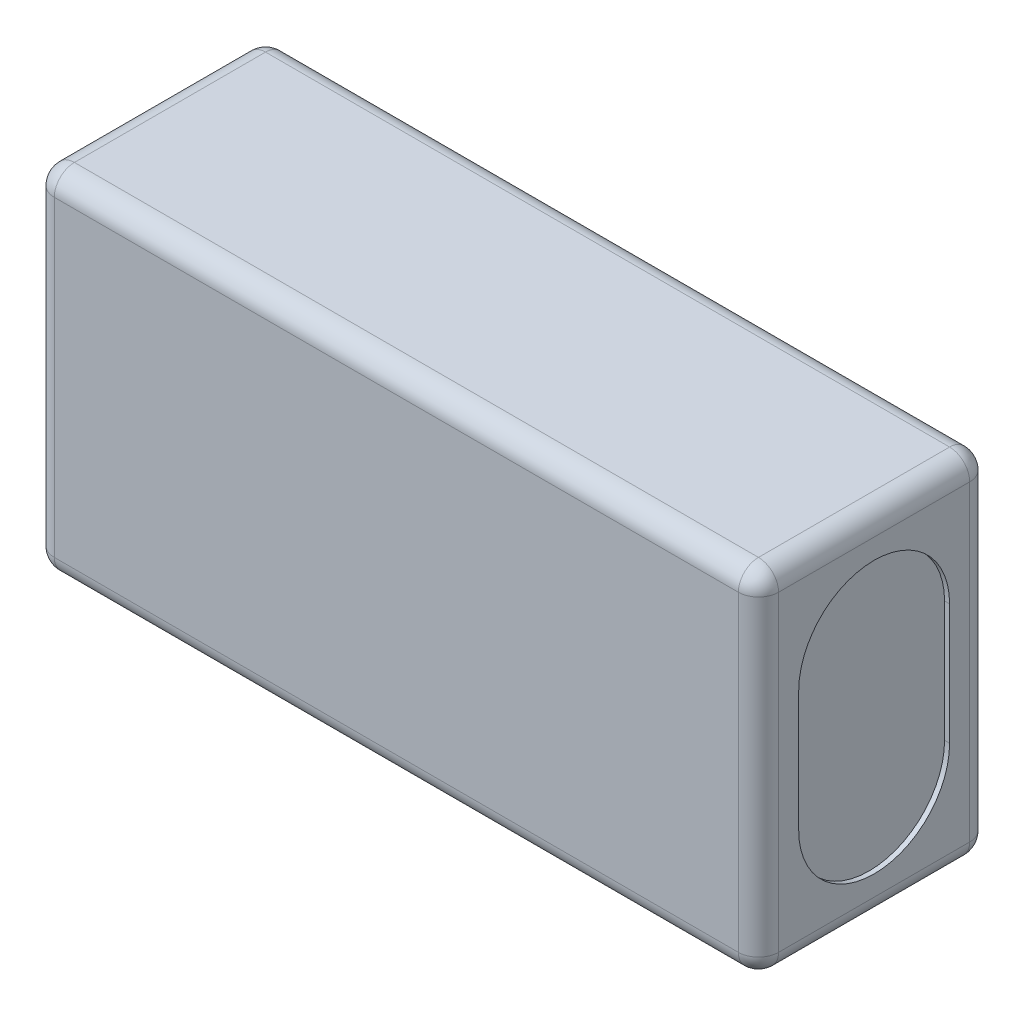
ISO-10303-21;
HEADER;
FILE_DESCRIPTION(('STEP AP214'),'2;1');
FILE_NAME('part.step','',(''),(''),'','','');
FILE_SCHEMA(('AUTOMOTIVE_DESIGN { 1 0 10303 214 1 1 1 1 }'));
ENDSEC;
DATA;
#1=APPLICATION_CONTEXT('core data for automotive mechanical design processes');
#2=APPLICATION_PROTOCOL_DEFINITION('international standard','automotive_design',2000,#1);
#3=PRODUCT_CONTEXT('',#1,'mechanical');
#4=PRODUCT('Part','Part','',(#3));
#5=PRODUCT_RELATED_PRODUCT_CATEGORY('part','',(#4));
#6=PRODUCT_DEFINITION_FORMATION('','',#4);
#7=PRODUCT_DEFINITION_CONTEXT('part definition',#1,'design');
#8=PRODUCT_DEFINITION('design','',#6,#7);
#9=PRODUCT_DEFINITION_SHAPE('','',#8);
#10=(LENGTH_UNIT() NAMED_UNIT(*) SI_UNIT(.MILLI.,.METRE.));
#11=(NAMED_UNIT(*) PLANE_ANGLE_UNIT() SI_UNIT($,.RADIAN.));
#12=(NAMED_UNIT(*) SI_UNIT($,.STERADIAN.) SOLID_ANGLE_UNIT());
#13=UNCERTAINTY_MEASURE_WITH_UNIT(LENGTH_MEASURE(1.E-05),#10,'distance_accuracy_value','');
#14=(GEOMETRIC_REPRESENTATION_CONTEXT(3) GLOBAL_UNCERTAINTY_ASSIGNED_CONTEXT((#13)) GLOBAL_UNIT_ASSIGNED_CONTEXT((#10,
#11,#12)) REPRESENTATION_CONTEXT('',''));
#15=CARTESIAN_POINT('',(0.,0.,0.));
#16=DIRECTION('',(0.,0.,1.));
#17=DIRECTION('',(1.,0.,0.));
#18=AXIS2_PLACEMENT_3D('',#15,#16,#17);
#19=CARTESIAN_POINT('',(-36.,17.5,23.));
#20=DIRECTION('',(1.,0.,0.));
#21=DIRECTION('',(0.,0.,-1.));
#22=AXIS2_PLACEMENT_3D('',#19,#20,#21);
#23=PLANE('',#22);
#24=DIRECTION('',(0.,-1.,0.));
#25=VECTOR('',#24,1.);
#26=CARTESIAN_POINT('',(-36.,17.5,2.));
#27=LINE('',#26,#25);
#28=CARTESIAN_POINT('',(-36.,15.5,2.));
#29=VERTEX_POINT('',#28);
#30=CARTESIAN_POINT('',(-36.,-15.5,2.));
#31=VERTEX_POINT('',#30);
#32=EDGE_CURVE('E259',#29,#31,#27,.T.);
#33=ORIENTED_EDGE('',*,*,#32,.T.);
#34=DIRECTION('',(0.,0.,-1.));
#35=VECTOR('',#34,1.);
#36=CARTESIAN_POINT('',(-36.,-15.5,23.));
#37=LINE('',#36,#35);
#38=CARTESIAN_POINT('',(-36.,-15.5,21.));
#39=VERTEX_POINT('',#38);
#40=EDGE_CURVE('E261',#31,#39,#37,.F.);
#41=ORIENTED_EDGE('',*,*,#40,.T.);
#42=DIRECTION('',(0.,-1.,0.));
#43=VECTOR('',#42,1.);
#44=CARTESIAN_POINT('',(-36.,17.5,21.));
#45=LINE('',#44,#43);
#46=CARTESIAN_POINT('',(-36.,15.5,21.));
#47=VERTEX_POINT('',#46);
#48=EDGE_CURVE('E255',#39,#47,#45,.F.);
#49=ORIENTED_EDGE('',*,*,#48,.T.);
#50=DIRECTION('',(0.,0.,-1.));
#51=VECTOR('',#50,1.);
#52=CARTESIAN_POINT('',(-36.,15.5,23.));
#53=LINE('',#52,#51);
#54=EDGE_CURVE('E257',#47,#29,#53,.T.);
#55=ORIENTED_EDGE('',*,*,#54,.T.);
#56=EDGE_LOOP('',(#33,#41,#49,#55));
#57=FACE_BOUND('',#56,.T.);
#58=CARTESIAN_POINT('',(-36.,6.,11.5));
#59=DIRECTION('',(1.,0.,0.));
#60=DIRECTION('',(0.,1.,0.));
#61=AXIS2_PLACEMENT_3D('',#58,#59,#60);
#62=CIRCLE('',#61,7.50000000000001);
#63=CARTESIAN_POINT('',(-36.,6.,4.));
#64=VERTEX_POINT('',#63);
#65=CARTESIAN_POINT('',(-36.,6.,19.));
#66=VERTEX_POINT('',#65);
#67=EDGE_CURVE('E192',#64,#66,#62,.T.);
#68=ORIENTED_EDGE('',*,*,#67,.T.);
#69=DIRECTION('',(0.,-1.,0.));
#70=VECTOR('',#69,1.);
#71=CARTESIAN_POINT('',(-36.,6.,19.));
#72=LINE('',#71,#70);
#73=CARTESIAN_POINT('',(-36.,-6.,19.));
#74=VERTEX_POINT('',#73);
#75=EDGE_CURVE('E196',#66,#74,#72,.T.);
#76=ORIENTED_EDGE('',*,*,#75,.T.);
#77=CARTESIAN_POINT('',(-36.,-6.,11.5));
#78=DIRECTION('',(1.,0.,0.));
#79=DIRECTION('',(0.,1.,0.));
#80=AXIS2_PLACEMENT_3D('',#77,#78,#79);
#81=CIRCLE('',#80,7.50000000000001);
#82=CARTESIAN_POINT('',(-36.,-5.99999999999999,3.99999999999999));
#83=VERTEX_POINT('',#82);
#84=EDGE_CURVE('E199',#74,#83,#81,.T.);
#85=ORIENTED_EDGE('',*,*,#84,.T.);
#86=DIRECTION('',(0.,1.,0.));
#87=VECTOR('',#86,1.);
#88=CARTESIAN_POINT('',(-36.,6.,4.));
#89=LINE('',#88,#87);
#90=EDGE_CURVE('E205',#83,#64,#89,.T.);
#91=ORIENTED_EDGE('',*,*,#90,.T.);
#92=EDGE_LOOP('',(#68,#76,#85,#91));
#93=FACE_BOUND('',#92,.T.);
#94=ADVANCED_FACE('F35',(#57,#93),#23,.F.);
#95=CARTESIAN_POINT('',(36.,17.5,23.));
#96=DIRECTION('',(-1.,0.,0.));
#97=DIRECTION('',(0.,0.,1.));
#98=AXIS2_PLACEMENT_3D('',#95,#96,#97);
#99=PLANE('',#98);
#100=DIRECTION('',(0.,1.,0.));
#101=VECTOR('',#100,1.);
#102=CARTESIAN_POINT('',(36.,-17.5,21.));
#103=LINE('',#102,#101);
#104=CARTESIAN_POINT('',(36.,15.5,21.));
#105=VERTEX_POINT('',#104);
#106=CARTESIAN_POINT('',(36.,-15.5,21.));
#107=VERTEX_POINT('',#106);
#108=EDGE_CURVE('E264',#105,#107,#103,.F.);
#109=ORIENTED_EDGE('',*,*,#108,.T.);
#110=DIRECTION('',(0.,0.,-1.));
#111=VECTOR('',#110,1.);
#112=CARTESIAN_POINT('',(36.,-15.5,23.));
#113=LINE('',#112,#111);
#114=CARTESIAN_POINT('',(36.,-15.5,2.));
#115=VERTEX_POINT('',#114);
#116=EDGE_CURVE('E270',#107,#115,#113,.T.);
#117=ORIENTED_EDGE('',*,*,#116,.T.);
#118=DIRECTION('',(0.,1.,0.));
#119=VECTOR('',#118,1.);
#120=CARTESIAN_POINT('',(36.,17.5,2.));
#121=LINE('',#120,#119);
#122=CARTESIAN_POINT('',(36.,15.5,2.));
#123=VERTEX_POINT('',#122);
#124=EDGE_CURVE('E268',#115,#123,#121,.T.);
#125=ORIENTED_EDGE('',*,*,#124,.T.);
#126=DIRECTION('',(0.,0.,-1.));
#127=VECTOR('',#126,1.);
#128=CARTESIAN_POINT('',(36.,15.5,23.));
#129=LINE('',#128,#127);
#130=EDGE_CURVE('E266',#123,#105,#129,.F.);
#131=ORIENTED_EDGE('',*,*,#130,.T.);
#132=EDGE_LOOP('',(#109,#117,#125,#131));
#133=FACE_BOUND('',#132,.T.);
#134=DIRECTION('',(0.,-1.,0.));
#135=VECTOR('',#134,1.);
#136=CARTESIAN_POINT('',(36.,6.,19.));
#137=LINE('',#136,#135);
#138=CARTESIAN_POINT('',(36.,6.,19.));
#139=VERTEX_POINT('',#138);
#140=CARTESIAN_POINT('',(36.,-6.,19.));
#141=VERTEX_POINT('',#140);
#142=EDGE_CURVE('E230',#139,#141,#137,.T.);
#143=ORIENTED_EDGE('',*,*,#142,.F.);
#144=CARTESIAN_POINT('',(36.,6.,11.5));
#145=DIRECTION('',(1.,0.,0.));
#146=DIRECTION('',(0.,1.,0.));
#147=AXIS2_PLACEMENT_3D('',#144,#145,#146);
#148=CIRCLE('',#147,7.50000000000001);
#149=CARTESIAN_POINT('',(36.,6.,4.));
#150=VERTEX_POINT('',#149);
#151=EDGE_CURVE('E211',#150,#139,#148,.T.);
#152=ORIENTED_EDGE('',*,*,#151,.F.);
#153=DIRECTION('',(0.,1.,0.));
#154=VECTOR('',#153,1.);
#155=CARTESIAN_POINT('',(36.,6.,4.));
#156=LINE('',#155,#154);
#157=CARTESIAN_POINT('',(36.,-5.99999999999999,3.99999999999999));
#158=VERTEX_POINT('',#157);
#159=EDGE_CURVE('E219',#158,#150,#156,.T.);
#160=ORIENTED_EDGE('',*,*,#159,.F.);
#161=CARTESIAN_POINT('',(36.,-6.,11.5));
#162=DIRECTION('',(1.,0.,0.));
#163=DIRECTION('',(0.,1.,0.));
#164=AXIS2_PLACEMENT_3D('',#161,#162,#163);
#165=CIRCLE('',#164,7.50000000000001);
#166=EDGE_CURVE('E233',#141,#158,#165,.T.);
#167=ORIENTED_EDGE('',*,*,#166,.F.);
#168=EDGE_LOOP('',(#143,#152,#160,#167));
#169=FACE_BOUND('',#168,.T.);
#170=ADVANCED_FACE('F398',(#133,#169),#99,.F.);
#171=CARTESIAN_POINT('',(-36.,17.5,23.));
#172=DIRECTION('',(0.,-1.,0.));
#173=DIRECTION('',(0.,0.,-1.));
#174=AXIS2_PLACEMENT_3D('',#171,#172,#173);
#175=PLANE('',#174);
#176=DIRECTION('',(0.,0.,-1.));
#177=VECTOR('',#176,1.);
#178=CARTESIAN_POINT('',(34.,17.5,23.));
#179=LINE('',#178,#177);
#180=CARTESIAN_POINT('',(34.,17.5,21.));
#181=VERTEX_POINT('',#180);
#182=CARTESIAN_POINT('',(34.,17.5,2.));
#183=VERTEX_POINT('',#182);
#184=EDGE_CURVE('E286',#181,#183,#179,.T.);
#185=ORIENTED_EDGE('',*,*,#184,.T.);
#186=DIRECTION('',(-1.,0.,0.));
#187=VECTOR('',#186,1.);
#188=CARTESIAN_POINT('',(-36.,17.5,2.));
#189=LINE('',#188,#187);
#190=CARTESIAN_POINT('',(-34.,17.5,2.));
#191=VERTEX_POINT('',#190);
#192=EDGE_CURVE('E289',#183,#191,#189,.T.);
#193=ORIENTED_EDGE('',*,*,#192,.T.);
#194=DIRECTION('',(0.,0.,-1.));
#195=VECTOR('',#194,1.);
#196=CARTESIAN_POINT('',(-34.,17.5,23.));
#197=LINE('',#196,#195);
#198=CARTESIAN_POINT('',(-34.,17.5,21.));
#199=VERTEX_POINT('',#198);
#200=EDGE_CURVE('E284',#191,#199,#197,.F.);
#201=ORIENTED_EDGE('',*,*,#200,.T.);
#202=DIRECTION('',(-1.,0.,0.));
#203=VECTOR('',#202,1.);
#204=CARTESIAN_POINT('',(36.,17.5,21.));
#205=LINE('',#204,#203);
#206=EDGE_CURVE('E282',#199,#181,#205,.F.);
#207=ORIENTED_EDGE('',*,*,#206,.T.);
#208=EDGE_LOOP('',(#185,#193,#201,#207));
#209=FACE_BOUND('',#208,.T.);
#210=ADVANCED_FACE('F413',(#209),#175,.F.);
#211=CARTESIAN_POINT('',(-36.,-17.5,23.));
#212=DIRECTION('',(0.,1.,0.));
#213=DIRECTION('',(0.,0.,1.));
#214=AXIS2_PLACEMENT_3D('',#211,#212,#213);
#215=PLANE('',#214);
#216=DIRECTION('',(0.,0.,-1.));
#217=VECTOR('',#216,1.);
#218=CARTESIAN_POINT('',(-34.,-17.5,23.));
#219=LINE('',#218,#217);
#220=CARTESIAN_POINT('',(-34.,-17.5,21.));
#221=VERTEX_POINT('',#220);
#222=CARTESIAN_POINT('',(-34.,-17.5,2.));
#223=VERTEX_POINT('',#222);
#224=EDGE_CURVE('E250',#221,#223,#219,.T.);
#225=ORIENTED_EDGE('',*,*,#224,.T.);
#226=DIRECTION('',(1.,0.,0.));
#227=VECTOR('',#226,1.);
#228=CARTESIAN_POINT('',(-36.,-17.5,2.));
#229=LINE('',#228,#227);
#230=CARTESIAN_POINT('',(34.,-17.5,2.));
#231=VERTEX_POINT('',#230);
#232=EDGE_CURVE('E253',#223,#231,#229,.T.);
#233=ORIENTED_EDGE('',*,*,#232,.T.);
#234=DIRECTION('',(0.,0.,-1.));
#235=VECTOR('',#234,1.);
#236=CARTESIAN_POINT('',(34.,-17.5,23.));
#237=LINE('',#236,#235);
#238=CARTESIAN_POINT('',(34.,-17.5,21.));
#239=VERTEX_POINT('',#238);
#240=EDGE_CURVE('E248',#231,#239,#237,.F.);
#241=ORIENTED_EDGE('',*,*,#240,.T.);
#242=DIRECTION('',(1.,0.,0.));
#243=VECTOR('',#242,1.);
#244=CARTESIAN_POINT('',(-36.,-17.5,21.));
#245=LINE('',#244,#243);
#246=EDGE_CURVE('E240',#239,#221,#245,.F.);
#247=ORIENTED_EDGE('',*,*,#246,.T.);
#248=EDGE_LOOP('',(#225,#233,#241,#247));
#249=FACE_BOUND('',#248,.T.);
#250=ADVANCED_FACE('F445',(#249),#215,.F.);
#251=CARTESIAN_POINT('',(0.,0.,23.));
#252=DIRECTION('',(0.,0.,1.));
#253=DIRECTION('',(1.,0.,0.));
#254=AXIS2_PLACEMENT_3D('',#251,#252,#253);
#255=PLANE('',#254);
#256=DIRECTION('',(0.,-1.,0.));
#257=VECTOR('',#256,1.);
#258=CARTESIAN_POINT('',(-34.,-17.5,23.));
#259=LINE('',#258,#257);
#260=CARTESIAN_POINT('',(-34.,15.5,23.));
#261=VERTEX_POINT('',#260);
#262=CARTESIAN_POINT('',(-34.,-15.5,23.));
#263=VERTEX_POINT('',#262);
#264=EDGE_CURVE('E44',#261,#263,#259,.T.);
#265=ORIENTED_EDGE('',*,*,#264,.T.);
#266=DIRECTION('',(1.,0.,0.));
#267=VECTOR('',#266,1.);
#268=CARTESIAN_POINT('',(36.,-15.5,23.));
#269=LINE('',#268,#267);
#270=CARTESIAN_POINT('',(34.,-15.5,23.));
#271=VERTEX_POINT('',#270);
#272=EDGE_CURVE('E11',#263,#271,#269,.T.);
#273=ORIENTED_EDGE('',*,*,#272,.T.);
#274=DIRECTION('',(0.,1.,0.));
#275=VECTOR('',#274,1.);
#276=CARTESIAN_POINT('',(34.,17.5,23.));
#277=LINE('',#276,#275);
#278=CARTESIAN_POINT('',(34.,15.5,23.));
#279=VERTEX_POINT('',#278);
#280=EDGE_CURVE('E291',#271,#279,#277,.T.);
#281=ORIENTED_EDGE('',*,*,#280,.T.);
#282=DIRECTION('',(-1.,0.,0.));
#283=VECTOR('',#282,1.);
#284=CARTESIAN_POINT('',(-36.,15.5,23.));
#285=LINE('',#284,#283);
#286=EDGE_CURVE('E55',#279,#261,#285,.T.);
#287=ORIENTED_EDGE('',*,*,#286,.T.);
#288=EDGE_LOOP('',(#265,#273,#281,#287));
#289=FACE_BOUND('',#288,.T.);
#290=ADVANCED_FACE('F391',(#289),#255,.T.);
#291=CARTESIAN_POINT('',(0.,0.,0.));
#292=DIRECTION('',(0.,0.,1.));
#293=DIRECTION('',(1.,0.,0.));
#294=AXIS2_PLACEMENT_3D('',#291,#292,#293);
#295=PLANE('',#294);
#296=DIRECTION('',(1.,0.,0.));
#297=VECTOR('',#296,1.);
#298=CARTESIAN_POINT('',(0.,-15.5,0.));
#299=LINE('',#298,#297);
#300=CARTESIAN_POINT('',(34.,-15.5,0.));
#301=VERTEX_POINT('',#300);
#302=CARTESIAN_POINT('',(-34.,-15.5,0.));
#303=VERTEX_POINT('',#302);
#304=EDGE_CURVE('E277',#301,#303,#299,.F.);
#305=ORIENTED_EDGE('',*,*,#304,.T.);
#306=DIRECTION('',(0.,-1.,0.));
#307=VECTOR('',#306,1.);
#308=CARTESIAN_POINT('',(-34.,0.,0.));
#309=LINE('',#308,#307);
#310=CARTESIAN_POINT('',(-34.,15.5,0.));
#311=VERTEX_POINT('',#310);
#312=EDGE_CURVE('E279',#303,#311,#309,.F.);
#313=ORIENTED_EDGE('',*,*,#312,.T.);
#314=DIRECTION('',(-1.,0.,0.));
#315=VECTOR('',#314,1.);
#316=CARTESIAN_POINT('',(0.,15.5,0.));
#317=LINE('',#316,#315);
#318=CARTESIAN_POINT('',(34.,15.5,0.));
#319=VERTEX_POINT('',#318);
#320=EDGE_CURVE('E273',#311,#319,#317,.F.);
#321=ORIENTED_EDGE('',*,*,#320,.T.);
#322=DIRECTION('',(0.,1.,0.));
#323=VECTOR('',#322,1.);
#324=CARTESIAN_POINT('',(34.,0.,0.));
#325=LINE('',#324,#323);
#326=EDGE_CURVE('E275',#319,#301,#325,.F.);
#327=ORIENTED_EDGE('',*,*,#326,.T.);
#328=EDGE_LOOP('',(#305,#313,#321,#327));
#329=FACE_BOUND('',#328,.T.);
#330=ADVANCED_FACE('F452',(#329),#295,.F.);
#331=CARTESIAN_POINT('',(35.5,6.,11.5));
#332=DIRECTION('',(1.,0.,0.));
#333=DIRECTION('',(0.,1.,0.));
#334=AXIS2_PLACEMENT_3D('',#331,#332,#333);
#335=CYLINDRICAL_SURFACE('',#334,7.50000000000001);
#336=ORIENTED_EDGE('',*,*,#151,.T.);
#337=DIRECTION('',(1.,0.,0.));
#338=VECTOR('',#337,1.);
#339=CARTESIAN_POINT('',(35.5,6.,19.));
#340=LINE('',#339,#338);
#341=CARTESIAN_POINT('',(35.5,6.,19.));
#342=VERTEX_POINT('',#341);
#343=EDGE_CURVE('E228',#342,#139,#340,.T.);
#344=ORIENTED_EDGE('',*,*,#343,.F.);
#345=CARTESIAN_POINT('',(35.5,6.,11.5));
#346=DIRECTION('',(1.,0.,0.));
#347=DIRECTION('',(0.,1.,0.));
#348=AXIS2_PLACEMENT_3D('',#345,#346,#347);
#349=CIRCLE('',#348,7.50000000000001);
#350=CARTESIAN_POINT('',(35.5,6.,4.));
#351=VERTEX_POINT('',#350);
#352=EDGE_CURVE('E215',#351,#342,#349,.T.);
#353=ORIENTED_EDGE('',*,*,#352,.F.);
#354=DIRECTION('',(1.,0.,0.));
#355=VECTOR('',#354,1.);
#356=CARTESIAN_POINT('',(35.5,6.,4.));
#357=LINE('',#356,#355);
#358=EDGE_CURVE('E238',#351,#150,#357,.T.);
#359=ORIENTED_EDGE('',*,*,#358,.T.);
#360=EDGE_LOOP('',(#336,#344,#353,#359));
#361=FACE_BOUND('',#360,.T.);
#362=ADVANCED_FACE('F534',(#361),#335,.F.);
#363=CARTESIAN_POINT('',(35.5,6.,4.));
#364=DIRECTION('',(0.,0.,-1.));
#365=DIRECTION('',(0.,1.,0.));
#366=AXIS2_PLACEMENT_3D('',#363,#364,#365);
#367=PLANE('',#366);
#368=ORIENTED_EDGE('',*,*,#159,.T.);
#369=ORIENTED_EDGE('',*,*,#358,.F.);
#370=DIRECTION('',(0.,1.,0.));
#371=VECTOR('',#370,1.);
#372=CARTESIAN_POINT('',(35.5,6.,4.));
#373=LINE('',#372,#371);
#374=CARTESIAN_POINT('',(35.5,-5.99999999999999,3.99999999999999));
#375=VERTEX_POINT('',#374);
#376=EDGE_CURVE('E225',#375,#351,#373,.T.);
#377=ORIENTED_EDGE('',*,*,#376,.F.);
#378=DIRECTION('',(1.,0.,0.));
#379=VECTOR('',#378,1.);
#380=CARTESIAN_POINT('',(35.5,-5.99999999999999,3.99999999999999));
#381=LINE('',#380,#379);
#382=EDGE_CURVE('E241',#375,#158,#381,.T.);
#383=ORIENTED_EDGE('',*,*,#382,.T.);
#384=EDGE_LOOP('',(#368,#369,#377,#383));
#385=FACE_BOUND('',#384,.T.);
#386=ADVANCED_FACE('F530',(#385),#367,.F.);
#387=CARTESIAN_POINT('',(35.5,-6.,11.5));
#388=DIRECTION('',(1.,0.,0.));
#389=DIRECTION('',(0.,1.,0.));
#390=AXIS2_PLACEMENT_3D('',#387,#388,#389);
#391=CYLINDRICAL_SURFACE('',#390,7.50000000000001);
#392=ORIENTED_EDGE('',*,*,#166,.T.);
#393=ORIENTED_EDGE('',*,*,#382,.F.);
#394=CARTESIAN_POINT('',(35.5,-6.,11.5));
#395=DIRECTION('',(1.,0.,0.));
#396=DIRECTION('',(0.,1.,0.));
#397=AXIS2_PLACEMENT_3D('',#394,#395,#396);
#398=CIRCLE('',#397,7.50000000000001);
#399=CARTESIAN_POINT('',(35.5,-6.,19.));
#400=VERTEX_POINT('',#399);
#401=EDGE_CURVE('E222',#400,#375,#398,.T.);
#402=ORIENTED_EDGE('',*,*,#401,.F.);
#403=DIRECTION('',(1.,0.,0.));
#404=VECTOR('',#403,1.);
#405=CARTESIAN_POINT('',(35.5,-6.,19.));
#406=LINE('',#405,#404);
#407=EDGE_CURVE('E243',#400,#141,#406,.T.);
#408=ORIENTED_EDGE('',*,*,#407,.T.);
#409=EDGE_LOOP('',(#392,#393,#402,#408));
#410=FACE_BOUND('',#409,.T.);
#411=ADVANCED_FACE('F533',(#410),#391,.F.);
#412=CARTESIAN_POINT('',(35.5,6.,19.));
#413=DIRECTION('',(0.,0.,1.));
#414=DIRECTION('',(0.,-1.,0.));
#415=AXIS2_PLACEMENT_3D('',#412,#413,#414);
#416=PLANE('',#415);
#417=ORIENTED_EDGE('',*,*,#142,.T.);
#418=ORIENTED_EDGE('',*,*,#407,.F.);
#419=DIRECTION('',(0.,-1.,0.));
#420=VECTOR('',#419,1.);
#421=CARTESIAN_POINT('',(35.5,6.,19.));
#422=LINE('',#421,#420);
#423=EDGE_CURVE('E218',#342,#400,#422,.T.);
#424=ORIENTED_EDGE('',*,*,#423,.F.);
#425=ORIENTED_EDGE('',*,*,#343,.T.);
#426=EDGE_LOOP('',(#417,#418,#424,#425));
#427=FACE_BOUND('',#426,.T.);
#428=ADVANCED_FACE('F528',(#427),#416,.F.);
#429=CARTESIAN_POINT('',(35.5,6.,11.5));
#430=DIRECTION('',(1.,0.,0.));
#431=DIRECTION('',(0.,1.,0.));
#432=AXIS2_PLACEMENT_3D('',#429,#430,#431);
#433=PLANE('',#432);
#434=ORIENTED_EDGE('',*,*,#352,.T.);
#435=ORIENTED_EDGE('',*,*,#423,.T.);
#436=ORIENTED_EDGE('',*,*,#401,.T.);
#437=ORIENTED_EDGE('',*,*,#376,.T.);
#438=EDGE_LOOP('',(#434,#435,#436,#437));
#439=FACE_BOUND('',#438,.T.);
#440=ADVANCED_FACE('F525',(#439),#433,.T.);
#441=CARTESIAN_POINT('',(-35.5,6.,11.5));
#442=DIRECTION('',(-1.,0.,0.));
#443=DIRECTION('',(0.,-1.,0.));
#444=AXIS2_PLACEMENT_3D('',#441,#442,#443);
#445=CYLINDRICAL_SURFACE('',#444,7.50000000000001);
#446=ORIENTED_EDGE('',*,*,#67,.F.);
#447=DIRECTION('',(-1.,0.,0.));
#448=VECTOR('',#447,1.);
#449=CARTESIAN_POINT('',(-35.5,6.,4.));
#450=LINE('',#449,#448);
#451=CARTESIAN_POINT('',(-35.5,6.,4.));
#452=VERTEX_POINT('',#451);
#453=EDGE_CURVE('E177',#452,#64,#450,.T.);
#454=ORIENTED_EDGE('',*,*,#453,.F.);
#455=CARTESIAN_POINT('',(-35.5,6.,11.5));
#456=DIRECTION('',(1.,0.,0.));
#457=DIRECTION('',(0.,1.,0.));
#458=AXIS2_PLACEMENT_3D('',#455,#456,#457);
#459=CIRCLE('',#458,7.50000000000001);
#460=CARTESIAN_POINT('',(-35.5,6.,19.));
#461=VERTEX_POINT('',#460);
#462=EDGE_CURVE('E184',#452,#461,#459,.T.);
#463=ORIENTED_EDGE('',*,*,#462,.T.);
#464=DIRECTION('',(-1.,0.,0.));
#465=VECTOR('',#464,1.);
#466=CARTESIAN_POINT('',(-35.5,6.,19.));
#467=LINE('',#466,#465);
#468=EDGE_CURVE('E209',#461,#66,#467,.T.);
#469=ORIENTED_EDGE('',*,*,#468,.T.);
#470=EDGE_LOOP('',(#446,#454,#463,#469));
#471=FACE_BOUND('',#470,.T.);
#472=ADVANCED_FACE('F188',(#471),#445,.F.);
#473=CARTESIAN_POINT('',(-35.5,6.,19.));
#474=DIRECTION('',(0.,0.,-1.));
#475=DIRECTION('',(0.,1.,0.));
#476=AXIS2_PLACEMENT_3D('',#473,#474,#475);
#477=PLANE('',#476);
#478=ORIENTED_EDGE('',*,*,#75,.F.);
#479=ORIENTED_EDGE('',*,*,#468,.F.);
#480=DIRECTION('',(0.,-1.,0.));
#481=VECTOR('',#480,1.);
#482=CARTESIAN_POINT('',(-35.5,6.,19.));
#483=LINE('',#482,#481);
#484=CARTESIAN_POINT('',(-35.5,-6.,19.));
#485=VERTEX_POINT('',#484);
#486=EDGE_CURVE('E193',#461,#485,#483,.T.);
#487=ORIENTED_EDGE('',*,*,#486,.T.);
#488=DIRECTION('',(-1.,0.,0.));
#489=VECTOR('',#488,1.);
#490=CARTESIAN_POINT('',(-35.5,-6.,19.));
#491=LINE('',#490,#489);
#492=EDGE_CURVE('E212',#485,#74,#491,.T.);
#493=ORIENTED_EDGE('',*,*,#492,.T.);
#494=EDGE_LOOP('',(#478,#479,#487,#493));
#495=FACE_BOUND('',#494,.T.);
#496=ADVANCED_FACE('F516',(#495),#477,.T.);
#497=CARTESIAN_POINT('',(-35.5,-6.,11.5));
#498=DIRECTION('',(-1.,0.,0.));
#499=DIRECTION('',(0.,-1.,0.));
#500=AXIS2_PLACEMENT_3D('',#497,#498,#499);
#501=CYLINDRICAL_SURFACE('',#500,7.50000000000001);
#502=ORIENTED_EDGE('',*,*,#84,.F.);
#503=ORIENTED_EDGE('',*,*,#492,.F.);
#504=CARTESIAN_POINT('',(-35.5,-6.,11.5));
#505=DIRECTION('',(1.,0.,0.));
#506=DIRECTION('',(0.,1.,0.));
#507=AXIS2_PLACEMENT_3D('',#504,#505,#506);
#508=CIRCLE('',#507,7.50000000000001);
#509=CARTESIAN_POINT('',(-35.5,-5.99999999999999,3.99999999999999));
#510=VERTEX_POINT('',#509);
#511=EDGE_CURVE('E183',#485,#510,#508,.T.);
#512=ORIENTED_EDGE('',*,*,#511,.T.);
#513=DIRECTION('',(-1.,0.,0.));
#514=VECTOR('',#513,1.);
#515=CARTESIAN_POINT('',(-35.5,-5.99999999999999,3.99999999999999));
#516=LINE('',#515,#514);
#517=EDGE_CURVE('E179',#510,#83,#516,.T.);
#518=ORIENTED_EDGE('',*,*,#517,.T.);
#519=EDGE_LOOP('',(#502,#503,#512,#518));
#520=FACE_BOUND('',#519,.T.);
#521=ADVANCED_FACE('F513',(#520),#501,.F.);
#522=CARTESIAN_POINT('',(-35.5,6.,4.));
#523=DIRECTION('',(0.,0.,1.));
#524=DIRECTION('',(0.,-1.,0.));
#525=AXIS2_PLACEMENT_3D('',#522,#523,#524);
#526=PLANE('',#525);
#527=ORIENTED_EDGE('',*,*,#90,.F.);
#528=ORIENTED_EDGE('',*,*,#517,.F.);
#529=DIRECTION('',(0.,1.,0.));
#530=VECTOR('',#529,1.);
#531=CARTESIAN_POINT('',(-35.5,6.,4.));
#532=LINE('',#531,#530);
#533=EDGE_CURVE('E173',#510,#452,#532,.T.);
#534=ORIENTED_EDGE('',*,*,#533,.T.);
#535=ORIENTED_EDGE('',*,*,#453,.T.);
#536=EDGE_LOOP('',(#527,#528,#534,#535));
#537=FACE_BOUND('',#536,.T.);
#538=ADVANCED_FACE('F176',(#537),#526,.T.);
#539=CARTESIAN_POINT('',(-35.5,6.,11.5));
#540=DIRECTION('',(-1.,0.,0.));
#541=DIRECTION('',(0.,1.,0.));
#542=AXIS2_PLACEMENT_3D('',#539,#540,#541);
#543=PLANE('',#542);
#544=ORIENTED_EDGE('',*,*,#462,.F.);
#545=ORIENTED_EDGE('',*,*,#533,.F.);
#546=ORIENTED_EDGE('',*,*,#511,.F.);
#547=ORIENTED_EDGE('',*,*,#486,.F.);
#548=EDGE_LOOP('',(#544,#545,#546,#547));
#549=FACE_BOUND('',#548,.T.);
#550=ADVANCED_FACE('F195',(#549),#543,.T.);
#551=CARTESIAN_POINT('',(34.,15.5,23.));
#552=DIRECTION('',(0.,0.,-1.));
#553=DIRECTION('',(-1.,0.,0.));
#554=AXIS2_PLACEMENT_3D('',#551,#552,#553);
#555=CYLINDRICAL_SURFACE('',#554,2.);
#556=CARTESIAN_POINT('',(34.,15.5,21.));
#557=DIRECTION('',(0.,0.,1.));
#558=DIRECTION('',(1.,0.,0.));
#559=AXIS2_PLACEMENT_3D('',#556,#557,#558);
#560=CIRCLE('',#559,2.);
#561=EDGE_CURVE('E39',#105,#181,#560,.T.);
#562=ORIENTED_EDGE('',*,*,#561,.F.);
#563=ORIENTED_EDGE('',*,*,#130,.F.);
#564=CARTESIAN_POINT('',(34.,15.5,2.));
#565=DIRECTION('',(0.,0.,-1.));
#566=DIRECTION('',(-1.,0.,0.));
#567=AXIS2_PLACEMENT_3D('',#564,#565,#566);
#568=CIRCLE('',#567,2.);
#569=EDGE_CURVE('E355',#183,#123,#568,.T.);
#570=ORIENTED_EDGE('',*,*,#569,.F.);
#571=ORIENTED_EDGE('',*,*,#184,.F.);
#572=EDGE_LOOP('',(#562,#563,#570,#571));
#573=FACE_BOUND('',#572,.T.);
#574=ADVANCED_FACE('F37',(#573),#555,.T.);
#575=CARTESIAN_POINT('',(34.,15.5,21.));
#576=DIRECTION('',(0.,0.,1.));
#577=DIRECTION('',(1.,0.,0.));
#578=AXIS2_PLACEMENT_3D('',#575,#576,#577);
#579=SPHERICAL_SURFACE('',#578,2.);
#580=CARTESIAN_POINT('',(34.,15.5,21.));
#581=DIRECTION('',(0.,1.,0.));
#582=DIRECTION('',(0.,0.,1.));
#583=AXIS2_PLACEMENT_3D('',#580,#581,#582);
#584=CIRCLE('',#583,2.);
#585=EDGE_CURVE('E350',#105,#279,#584,.F.);
#586=ORIENTED_EDGE('',*,*,#585,.F.);
#587=ORIENTED_EDGE('',*,*,#561,.T.);
#588=CARTESIAN_POINT('',(34.,15.5,21.));
#589=DIRECTION('',(1.,0.,0.));
#590=DIRECTION('',(0.,0.,-1.));
#591=AXIS2_PLACEMENT_3D('',#588,#589,#590);
#592=CIRCLE('',#591,2.);
#593=EDGE_CURVE('E353',#279,#181,#592,.F.);
#594=ORIENTED_EDGE('',*,*,#593,.F.);
#595=EDGE_LOOP('',(#586,#587,#594));
#596=FACE_BOUND('',#595,.T.);
#597=ADVANCED_FACE('F366',(#596),#579,.T.);
#598=CARTESIAN_POINT('',(34.,15.5,2.));
#599=DIRECTION('',(0.,0.,1.));
#600=DIRECTION('',(1.,0.,0.));
#601=AXIS2_PLACEMENT_3D('',#598,#599,#600);
#602=SPHERICAL_SURFACE('',#601,2.);
#603=CARTESIAN_POINT('',(34.,15.5,2.));
#604=DIRECTION('',(1.,0.,0.));
#605=DIRECTION('',(0.,0.,-1.));
#606=AXIS2_PLACEMENT_3D('',#603,#604,#605);
#607=CIRCLE('',#606,2.);
#608=EDGE_CURVE('E344',#183,#319,#607,.F.);
#609=ORIENTED_EDGE('',*,*,#608,.F.);
#610=ORIENTED_EDGE('',*,*,#569,.T.);
#611=CARTESIAN_POINT('',(34.,15.5,2.));
#612=DIRECTION('',(0.,1.,0.));
#613=DIRECTION('',(0.,0.,1.));
#614=AXIS2_PLACEMENT_3D('',#611,#612,#613);
#615=CIRCLE('',#614,2.);
#616=EDGE_CURVE('E347',#319,#123,#615,.F.);
#617=ORIENTED_EDGE('',*,*,#616,.F.);
#618=EDGE_LOOP('',(#609,#610,#617));
#619=FACE_BOUND('',#618,.T.);
#620=ADVANCED_FACE('F500',(#619),#602,.T.);
#621=CARTESIAN_POINT('',(0.,15.5,21.));
#622=DIRECTION('',(1.,0.,0.));
#623=DIRECTION('',(0.,0.,-1.));
#624=AXIS2_PLACEMENT_3D('',#621,#622,#623);
#625=CYLINDRICAL_SURFACE('',#624,2.);
#626=ORIENTED_EDGE('',*,*,#593,.T.);
#627=ORIENTED_EDGE('',*,*,#206,.F.);
#628=CARTESIAN_POINT('',(-34.,15.5,21.));
#629=DIRECTION('',(-1.,0.,0.));
#630=DIRECTION('',(0.,0.,1.));
#631=AXIS2_PLACEMENT_3D('',#628,#629,#630);
#632=CIRCLE('',#631,2.);
#633=EDGE_CURVE('E338',#261,#199,#632,.T.);
#634=ORIENTED_EDGE('',*,*,#633,.F.);
#635=ORIENTED_EDGE('',*,*,#286,.F.);
#636=EDGE_LOOP('',(#626,#627,#634,#635));
#637=FACE_BOUND('',#636,.T.);
#638=ADVANCED_FACE('F373',(#637),#625,.T.);
#639=CARTESIAN_POINT('',(34.,0.,21.));
#640=DIRECTION('',(0.,-1.,0.));
#641=DIRECTION('',(0.,0.,-1.));
#642=AXIS2_PLACEMENT_3D('',#639,#640,#641);
#643=CYLINDRICAL_SURFACE('',#642,2.);
#644=ORIENTED_EDGE('',*,*,#585,.T.);
#645=ORIENTED_EDGE('',*,*,#280,.F.);
#646=CARTESIAN_POINT('',(34.,-15.5,21.));
#647=DIRECTION('',(0.,-1.,0.));
#648=DIRECTION('',(0.,0.,-1.));
#649=AXIS2_PLACEMENT_3D('',#646,#647,#648);
#650=CIRCLE('',#649,2.);
#651=EDGE_CURVE('E335',#107,#271,#650,.T.);
#652=ORIENTED_EDGE('',*,*,#651,.F.);
#653=ORIENTED_EDGE('',*,*,#108,.F.);
#654=EDGE_LOOP('',(#644,#645,#652,#653));
#655=FACE_BOUND('',#654,.T.);
#656=ADVANCED_FACE('F395',(#655),#643,.T.);
#657=CARTESIAN_POINT('',(34.,-15.5,23.));
#658=DIRECTION('',(0.,0.,-1.));
#659=DIRECTION('',(-1.,0.,0.));
#660=AXIS2_PLACEMENT_3D('',#657,#658,#659);
#661=CYLINDRICAL_SURFACE('',#660,2.);
#662=CARTESIAN_POINT('',(34.,-15.5,2.));
#663=DIRECTION('',(0.,0.,-1.));
#664=DIRECTION('',(-1.,0.,0.));
#665=AXIS2_PLACEMENT_3D('',#662,#663,#664);
#666=CIRCLE('',#665,2.);
#667=EDGE_CURVE('E329',#115,#231,#666,.T.);
#668=ORIENTED_EDGE('',*,*,#667,.F.);
#669=ORIENTED_EDGE('',*,*,#116,.F.);
#670=CARTESIAN_POINT('',(34.,-15.5,21.));
#671=DIRECTION('',(0.,0.,1.));
#672=DIRECTION('',(1.,0.,0.));
#673=AXIS2_PLACEMENT_3D('',#670,#671,#672);
#674=CIRCLE('',#673,2.);
#675=EDGE_CURVE('E332',#239,#107,#674,.T.);
#676=ORIENTED_EDGE('',*,*,#675,.F.);
#677=ORIENTED_EDGE('',*,*,#240,.F.);
#678=EDGE_LOOP('',(#668,#669,#676,#677));
#679=FACE_BOUND('',#678,.T.);
#680=ADVANCED_FACE('F403',(#679),#661,.T.);
#681=CARTESIAN_POINT('',(34.,17.5,2.));
#682=DIRECTION('',(0.,1.,0.));
#683=DIRECTION('',(0.,0.,1.));
#684=AXIS2_PLACEMENT_3D('',#681,#682,#683);
#685=CYLINDRICAL_SURFACE('',#684,2.);
#686=ORIENTED_EDGE('',*,*,#616,.T.);
#687=ORIENTED_EDGE('',*,*,#124,.F.);
#688=CARTESIAN_POINT('',(34.,-15.5,2.));
#689=DIRECTION('',(0.,-1.,0.));
#690=DIRECTION('',(1.,0.,0.));
#691=AXIS2_PLACEMENT_3D('',#688,#689,#690);
#692=CIRCLE('',#691,2.);
#693=EDGE_CURVE('E327',#301,#115,#692,.T.);
#694=ORIENTED_EDGE('',*,*,#693,.F.);
#695=ORIENTED_EDGE('',*,*,#326,.F.);
#696=EDGE_LOOP('',(#686,#687,#694,#695));
#697=FACE_BOUND('',#696,.T.);
#698=ADVANCED_FACE('F410',(#697),#685,.T.);
#699=CARTESIAN_POINT('',(-36.,15.5,2.));
#700=DIRECTION('',(-1.,0.,0.));
#701=DIRECTION('',(0.,0.,1.));
#702=AXIS2_PLACEMENT_3D('',#699,#700,#701);
#703=CYLINDRICAL_SURFACE('',#702,2.);
#704=ORIENTED_EDGE('',*,*,#608,.T.);
#705=ORIENTED_EDGE('',*,*,#320,.F.);
#706=CARTESIAN_POINT('',(-34.,15.5,2.));
#707=DIRECTION('',(-1.,0.,0.));
#708=DIRECTION('',(0.,0.,1.));
#709=AXIS2_PLACEMENT_3D('',#706,#707,#708);
#710=CIRCLE('',#709,2.);
#711=EDGE_CURVE('E324',#191,#311,#710,.T.);
#712=ORIENTED_EDGE('',*,*,#711,.F.);
#713=ORIENTED_EDGE('',*,*,#192,.F.);
#714=EDGE_LOOP('',(#704,#705,#712,#713));
#715=FACE_BOUND('',#714,.T.);
#716=ADVANCED_FACE('F423',(#715),#703,.T.);
#717=CARTESIAN_POINT('',(-34.,15.5,23.));
#718=DIRECTION('',(0.,0.,-1.));
#719=DIRECTION('',(-1.,0.,0.));
#720=AXIS2_PLACEMENT_3D('',#717,#718,#719);
#721=CYLINDRICAL_SURFACE('',#720,2.);
#722=CARTESIAN_POINT('',(-34.,15.5,21.));
#723=DIRECTION('',(0.,0.,1.));
#724=DIRECTION('',(1.,0.,0.));
#725=AXIS2_PLACEMENT_3D('',#722,#723,#724);
#726=CIRCLE('',#725,2.);
#727=EDGE_CURVE('E341',#199,#47,#726,.T.);
#728=ORIENTED_EDGE('',*,*,#727,.F.);
#729=ORIENTED_EDGE('',*,*,#200,.F.);
#730=CARTESIAN_POINT('',(-34.,15.5,2.));
#731=DIRECTION('',(0.,0.,-1.));
#732=DIRECTION('',(-1.,0.,0.));
#733=AXIS2_PLACEMENT_3D('',#730,#731,#732);
#734=CIRCLE('',#733,2.);
#735=EDGE_CURVE('E321',#29,#191,#734,.T.);
#736=ORIENTED_EDGE('',*,*,#735,.F.);
#737=ORIENTED_EDGE('',*,*,#54,.F.);
#738=EDGE_LOOP('',(#728,#729,#736,#737));
#739=FACE_BOUND('',#738,.T.);
#740=ADVANCED_FACE('F418',(#739),#721,.T.);
#741=CARTESIAN_POINT('',(-34.,15.5,21.));
#742=DIRECTION('',(0.,0.,1.));
#743=DIRECTION('',(1.,0.,0.));
#744=AXIS2_PLACEMENT_3D('',#741,#742,#743);
#745=SPHERICAL_SURFACE('',#744,2.);
#746=ORIENTED_EDGE('',*,*,#633,.T.);
#747=ORIENTED_EDGE('',*,*,#727,.T.);
#748=CARTESIAN_POINT('',(-34.,15.5,21.));
#749=DIRECTION('',(0.,1.,0.));
#750=DIRECTION('',(0.,0.,1.));
#751=AXIS2_PLACEMENT_3D('',#748,#749,#750);
#752=CIRCLE('',#751,2.);
#753=EDGE_CURVE('E318',#261,#47,#752,.F.);
#754=ORIENTED_EDGE('',*,*,#753,.F.);
#755=EDGE_LOOP('',(#746,#747,#754));
#756=FACE_BOUND('',#755,.T.);
#757=ADVANCED_FACE('F377',(#756),#745,.T.);
#758=CARTESIAN_POINT('',(34.,-15.5,21.));
#759=DIRECTION('',(0.,0.,1.));
#760=DIRECTION('',(1.,0.,0.));
#761=AXIS2_PLACEMENT_3D('',#758,#759,#760);
#762=SPHERICAL_SURFACE('',#761,2.);
#763=ORIENTED_EDGE('',*,*,#675,.T.);
#764=ORIENTED_EDGE('',*,*,#651,.T.);
#765=CARTESIAN_POINT('',(34.,-15.5,21.));
#766=DIRECTION('',(1.,0.,0.));
#767=DIRECTION('',(0.,0.,-1.));
#768=AXIS2_PLACEMENT_3D('',#765,#766,#767);
#769=CIRCLE('',#768,2.);
#770=EDGE_CURVE('E316',#239,#271,#769,.F.);
#771=ORIENTED_EDGE('',*,*,#770,.F.);
#772=EDGE_LOOP('',(#763,#764,#771));
#773=FACE_BOUND('',#772,.T.);
#774=ADVANCED_FACE('F482',(#773),#762,.T.);
#775=CARTESIAN_POINT('',(34.,-15.5,2.));
#776=DIRECTION('',(0.,0.,1.));
#777=DIRECTION('',(1.,0.,0.));
#778=AXIS2_PLACEMENT_3D('',#775,#776,#777);
#779=SPHERICAL_SURFACE('',#778,2.);
#780=ORIENTED_EDGE('',*,*,#693,.T.);
#781=ORIENTED_EDGE('',*,*,#667,.T.);
#782=CARTESIAN_POINT('',(34.,-15.5,2.));
#783=DIRECTION('',(1.,0.,0.));
#784=DIRECTION('',(0.,0.,-1.));
#785=AXIS2_PLACEMENT_3D('',#782,#783,#784);
#786=CIRCLE('',#785,2.);
#787=EDGE_CURVE('E313',#301,#231,#786,.F.);
#788=ORIENTED_EDGE('',*,*,#787,.F.);
#789=EDGE_LOOP('',(#780,#781,#788));
#790=FACE_BOUND('',#789,.T.);
#791=ADVANCED_FACE('F479',(#790),#779,.T.);
#792=CARTESIAN_POINT('',(-34.,15.5,2.));
#793=DIRECTION('',(0.,0.,1.));
#794=DIRECTION('',(1.,0.,0.));
#795=AXIS2_PLACEMENT_3D('',#792,#793,#794);
#796=SPHERICAL_SURFACE('',#795,2.);
#797=ORIENTED_EDGE('',*,*,#735,.T.);
#798=ORIENTED_EDGE('',*,*,#711,.T.);
#799=CARTESIAN_POINT('',(-34.,15.5,2.));
#800=DIRECTION('',(0.,1.,0.));
#801=DIRECTION('',(0.,0.,1.));
#802=AXIS2_PLACEMENT_3D('',#799,#800,#801);
#803=CIRCLE('',#802,2.);
#804=EDGE_CURVE('E311',#29,#311,#803,.F.);
#805=ORIENTED_EDGE('',*,*,#804,.F.);
#806=EDGE_LOOP('',(#797,#798,#805));
#807=FACE_BOUND('',#806,.T.);
#808=ADVANCED_FACE('F425',(#807),#796,.T.);
#809=CARTESIAN_POINT('',(-34.,0.,21.));
#810=DIRECTION('',(0.,1.,0.));
#811=DIRECTION('',(0.,0.,1.));
#812=AXIS2_PLACEMENT_3D('',#809,#810,#811);
#813=CYLINDRICAL_SURFACE('',#812,2.);
#814=ORIENTED_EDGE('',*,*,#753,.T.);
#815=ORIENTED_EDGE('',*,*,#48,.F.);
#816=CARTESIAN_POINT('',(-34.,-15.5,21.));
#817=DIRECTION('',(0.,-1.,0.));
#818=DIRECTION('',(0.,0.,-1.));
#819=AXIS2_PLACEMENT_3D('',#816,#817,#818);
#820=CIRCLE('',#819,2.);
#821=EDGE_CURVE('E308',#263,#39,#820,.T.);
#822=ORIENTED_EDGE('',*,*,#821,.F.);
#823=ORIENTED_EDGE('',*,*,#264,.F.);
#824=EDGE_LOOP('',(#814,#815,#822,#823));
#825=FACE_BOUND('',#824,.T.);
#826=ADVANCED_FACE('F381',(#825),#813,.T.);
#827=CARTESIAN_POINT('',(0.,-15.5,21.));
#828=DIRECTION('',(-1.,0.,0.));
#829=DIRECTION('',(0.,0.,1.));
#830=AXIS2_PLACEMENT_3D('',#827,#828,#829);
#831=CYLINDRICAL_SURFACE('',#830,2.);
#832=ORIENTED_EDGE('',*,*,#770,.T.);
#833=ORIENTED_EDGE('',*,*,#272,.F.);
#834=CARTESIAN_POINT('',(-34.,-15.5,21.));
#835=DIRECTION('',(-1.,0.,0.));
#836=DIRECTION('',(0.,0.,1.));
#837=AXIS2_PLACEMENT_3D('',#834,#835,#836);
#838=CIRCLE('',#837,2.);
#839=EDGE_CURVE('E305',#221,#263,#838,.T.);
#840=ORIENTED_EDGE('',*,*,#839,.F.);
#841=ORIENTED_EDGE('',*,*,#246,.F.);
#842=EDGE_LOOP('',(#832,#833,#840,#841));
#843=FACE_BOUND('',#842,.T.);
#844=ADVANCED_FACE('F389',(#843),#831,.T.);
#845=CARTESIAN_POINT('',(-36.,-15.5,2.));
#846=DIRECTION('',(1.,0.,0.));
#847=DIRECTION('',(0.,0.,-1.));
#848=AXIS2_PLACEMENT_3D('',#845,#846,#847);
#849=CYLINDRICAL_SURFACE('',#848,2.);
#850=ORIENTED_EDGE('',*,*,#787,.T.);
#851=ORIENTED_EDGE('',*,*,#232,.F.);
#852=CARTESIAN_POINT('',(-34.,-15.5,2.));
#853=DIRECTION('',(-1.,0.,0.));
#854=DIRECTION('',(0.,0.,1.));
#855=AXIS2_PLACEMENT_3D('',#852,#853,#854);
#856=CIRCLE('',#855,2.);
#857=EDGE_CURVE('E302',#303,#223,#856,.T.);
#858=ORIENTED_EDGE('',*,*,#857,.F.);
#859=ORIENTED_EDGE('',*,*,#304,.F.);
#860=EDGE_LOOP('',(#850,#851,#858,#859));
#861=FACE_BOUND('',#860,.T.);
#862=ADVANCED_FACE('F443',(#861),#849,.T.);
#863=CARTESIAN_POINT('',(-34.,17.5,2.));
#864=DIRECTION('',(0.,-1.,0.));
#865=DIRECTION('',(0.,0.,-1.));
#866=AXIS2_PLACEMENT_3D('',#863,#864,#865);
#867=CYLINDRICAL_SURFACE('',#866,2.);
#868=ORIENTED_EDGE('',*,*,#804,.T.);
#869=ORIENTED_EDGE('',*,*,#312,.F.);
#870=CARTESIAN_POINT('',(-34.,-15.5,2.));
#871=DIRECTION('',(0.,-1.,0.));
#872=DIRECTION('',(0.,0.,-1.));
#873=AXIS2_PLACEMENT_3D('',#870,#871,#872);
#874=CIRCLE('',#873,2.);
#875=EDGE_CURVE('E299',#31,#303,#874,.T.);
#876=ORIENTED_EDGE('',*,*,#875,.F.);
#877=ORIENTED_EDGE('',*,*,#32,.F.);
#878=EDGE_LOOP('',(#868,#869,#876,#877));
#879=FACE_BOUND('',#878,.T.);
#880=ADVANCED_FACE('F430',(#879),#867,.T.);
#881=CARTESIAN_POINT('',(-34.,-15.5,21.));
#882=DIRECTION('',(0.,0.,1.));
#883=DIRECTION('',(1.,0.,0.));
#884=AXIS2_PLACEMENT_3D('',#881,#882,#883);
#885=SPHERICAL_SURFACE('',#884,2.);
#886=ORIENTED_EDGE('',*,*,#839,.T.);
#887=ORIENTED_EDGE('',*,*,#821,.T.);
#888=CARTESIAN_POINT('',(-34.,-15.5,21.));
#889=DIRECTION('',(0.,0.,1.));
#890=DIRECTION('',(1.,0.,0.));
#891=AXIS2_PLACEMENT_3D('',#888,#889,#890);
#892=CIRCLE('',#891,2.);
#893=EDGE_CURVE('E297',#221,#39,#892,.F.);
#894=ORIENTED_EDGE('',*,*,#893,.F.);
#895=EDGE_LOOP('',(#886,#887,#894));
#896=FACE_BOUND('',#895,.T.);
#897=ADVANCED_FACE('F385',(#896),#885,.T.);
#898=CARTESIAN_POINT('',(-34.,-15.5,2.));
#899=DIRECTION('',(0.,0.,1.));
#900=DIRECTION('',(1.,0.,0.));
#901=AXIS2_PLACEMENT_3D('',#898,#899,#900);
#902=SPHERICAL_SURFACE('',#901,2.);
#903=ORIENTED_EDGE('',*,*,#875,.T.);
#904=ORIENTED_EDGE('',*,*,#857,.T.);
#905=CARTESIAN_POINT('',(-34.,-15.5,2.));
#906=DIRECTION('',(0.,0.,-1.));
#907=DIRECTION('',(-1.,0.,0.));
#908=AXIS2_PLACEMENT_3D('',#905,#906,#907);
#909=CIRCLE('',#908,2.);
#910=EDGE_CURVE('E295',#31,#223,#909,.F.);
#911=ORIENTED_EDGE('',*,*,#910,.F.);
#912=EDGE_LOOP('',(#903,#904,#911));
#913=FACE_BOUND('',#912,.T.);
#914=ADVANCED_FACE('F438',(#913),#902,.T.);
#915=CARTESIAN_POINT('',(-34.,-15.5,23.));
#916=DIRECTION('',(0.,0.,-1.));
#917=DIRECTION('',(-1.,0.,0.));
#918=AXIS2_PLACEMENT_3D('',#915,#916,#917);
#919=CYLINDRICAL_SURFACE('',#918,2.);
#920=ORIENTED_EDGE('',*,*,#893,.T.);
#921=ORIENTED_EDGE('',*,*,#40,.F.);
#922=ORIENTED_EDGE('',*,*,#910,.T.);
#923=ORIENTED_EDGE('',*,*,#224,.F.);
#924=EDGE_LOOP('',(#920,#921,#922,#923));
#925=FACE_BOUND('',#924,.T.);
#926=ADVANCED_FACE('F436',(#925),#919,.T.);
#927=CLOSED_SHELL('',(#94,#170,#210,#250,#290,#330,#362,#386,#411,#428,#440,#472,#496,#521,#538,
#550,#574,#597,#620,#638,#656,#680,#698,#716,#740,#757,#774,#791,#808,#826,#844,#862,#880,#897,
#914,#926));
#928=MANIFOLD_SOLID_BREP('B2',#927);
#929=ADVANCED_BREP_SHAPE_REPRESENTATION('',(#18,#928),#14);
#930=SHAPE_DEFINITION_REPRESENTATION(#9,#929);
ENDSEC;
END-ISO-10303-21;
